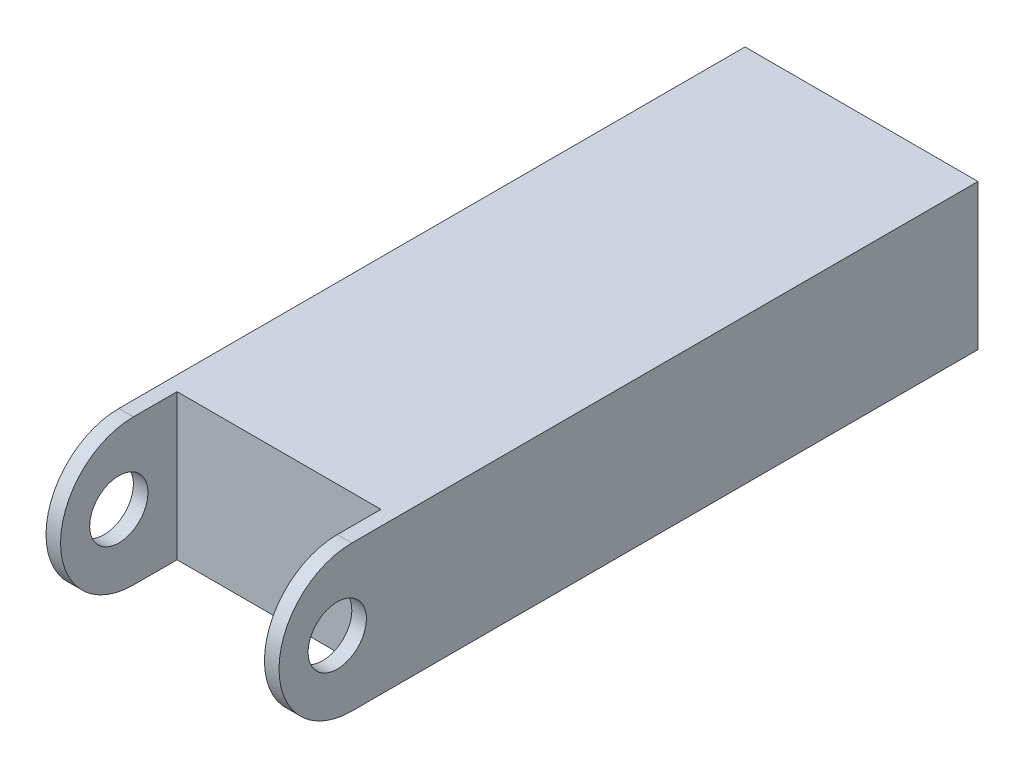
ISO-10303-21;
HEADER;
FILE_DESCRIPTION(('STEP AP214'),'2;1');
FILE_NAME('part.step','',(''),(''),'','','');
FILE_SCHEMA(('AUTOMOTIVE_DESIGN { 1 0 10303 214 1 1 1 1 }'));
ENDSEC;
DATA;
#1=APPLICATION_CONTEXT('core data for automotive mechanical design processes');
#2=APPLICATION_PROTOCOL_DEFINITION('international standard','automotive_design',2000,#1);
#3=PRODUCT_CONTEXT('',#1,'mechanical');
#4=PRODUCT('Part','Part','',(#3));
#5=PRODUCT_RELATED_PRODUCT_CATEGORY('part','',(#4));
#6=PRODUCT_DEFINITION_FORMATION('','',#4);
#7=PRODUCT_DEFINITION_CONTEXT('part definition',#1,'design');
#8=PRODUCT_DEFINITION('design','',#6,#7);
#9=PRODUCT_DEFINITION_SHAPE('','',#8);
#10=(LENGTH_UNIT() NAMED_UNIT(*) SI_UNIT(.MILLI.,.METRE.));
#11=(NAMED_UNIT(*) PLANE_ANGLE_UNIT() SI_UNIT($,.RADIAN.));
#12=(NAMED_UNIT(*) SI_UNIT($,.STERADIAN.) SOLID_ANGLE_UNIT());
#13=UNCERTAINTY_MEASURE_WITH_UNIT(LENGTH_MEASURE(1.E-05),#10,'distance_accuracy_value','');
#14=(GEOMETRIC_REPRESENTATION_CONTEXT(3) GLOBAL_UNCERTAINTY_ASSIGNED_CONTEXT((#13)) GLOBAL_UNIT_ASSIGNED_CONTEXT((#10,
#11,#12)) REPRESENTATION_CONTEXT('',''));
#15=CARTESIAN_POINT('',(0.,0.,0.));
#16=DIRECTION('',(0.,0.,1.));
#17=DIRECTION('',(1.,0.,0.));
#18=AXIS2_PLACEMENT_3D('',#15,#16,#17);
#19=CARTESIAN_POINT('',(-35.,0.,15.));
#20=DIRECTION('',(-1.,0.,0.));
#21=DIRECTION('',(0.,-1.,0.));
#22=AXIS2_PLACEMENT_3D('',#19,#20,#21);
#23=CYLINDRICAL_SURFACE('',#22,25.);
#24=DIRECTION('',(1.,0.,0.));
#25=VECTOR('',#24,1.);
#26=CARTESIAN_POINT('',(-35.,-25.,15.));
#27=LINE('',#26,#25);
#28=CARTESIAN_POINT('',(-35.,-25.,15.));
#29=VERTEX_POINT('',#28);
#30=CARTESIAN_POINT('',(-40.,-25.,15.));
#31=VERTEX_POINT('',#30);
#32=EDGE_CURVE('E158',#29,#31,#27,.F.);
#33=ORIENTED_EDGE('',*,*,#32,.F.);
#34=CARTESIAN_POINT('',(-35.,0.,15.));
#35=DIRECTION('',(1.,0.,0.));
#36=DIRECTION('',(0.,1.,0.));
#37=AXIS2_PLACEMENT_3D('',#34,#35,#36);
#38=CIRCLE('',#37,25.);
#39=CARTESIAN_POINT('',(-35.,25.,15.));
#40=VERTEX_POINT('',#39);
#41=EDGE_CURVE('E45',#40,#29,#38,.T.);
#42=ORIENTED_EDGE('',*,*,#41,.F.);
#43=DIRECTION('',(1.,0.,0.));
#44=VECTOR('',#43,1.);
#45=CARTESIAN_POINT('',(-35.,25.,15.));
#46=LINE('',#45,#44);
#47=CARTESIAN_POINT('',(-40.,25.,15.));
#48=VERTEX_POINT('',#47);
#49=EDGE_CURVE('E161',#48,#40,#46,.T.);
#50=ORIENTED_EDGE('',*,*,#49,.F.);
#51=CARTESIAN_POINT('',(-40.,0.,15.));
#52=DIRECTION('',(-1.,0.,0.));
#53=DIRECTION('',(0.,-1.,0.));
#54=AXIS2_PLACEMENT_3D('',#51,#52,#53);
#55=CIRCLE('',#54,25.);
#56=EDGE_CURVE('E11',#31,#48,#55,.T.);
#57=ORIENTED_EDGE('',*,*,#56,.F.);
#58=EDGE_LOOP('',(#33,#42,#50,#57));
#59=FACE_BOUND('',#58,.T.);
#60=ADVANCED_FACE('F37',(#59),#23,.T.);
#61=CARTESIAN_POINT('',(40.,0.,15.));
#62=DIRECTION('',(1.,0.,0.));
#63=DIRECTION('',(0.,1.,0.));
#64=AXIS2_PLACEMENT_3D('',#61,#62,#63);
#65=CYLINDRICAL_SURFACE('',#64,25.);
#66=DIRECTION('',(1.,0.,0.));
#67=VECTOR('',#66,1.);
#68=CARTESIAN_POINT('',(-40.,-25.,15.));
#69=LINE('',#68,#67);
#70=CARTESIAN_POINT('',(40.,-25.,15.));
#71=VERTEX_POINT('',#70);
#72=CARTESIAN_POINT('',(35.,-25.,15.));
#73=VERTEX_POINT('',#72);
#74=EDGE_CURVE('E119',#71,#73,#69,.F.);
#75=ORIENTED_EDGE('',*,*,#74,.F.);
#76=CARTESIAN_POINT('',(40.,0.,15.));
#77=DIRECTION('',(1.,0.,0.));
#78=DIRECTION('',(0.,1.,0.));
#79=AXIS2_PLACEMENT_3D('',#76,#77,#78);
#80=CIRCLE('',#79,25.);
#81=CARTESIAN_POINT('',(40.,25.,15.));
#82=VERTEX_POINT('',#81);
#83=EDGE_CURVE('E154',#82,#71,#80,.T.);
#84=ORIENTED_EDGE('',*,*,#83,.F.);
#85=DIRECTION('',(1.,0.,0.));
#86=VECTOR('',#85,1.);
#87=CARTESIAN_POINT('',(-40.,25.,15.));
#88=LINE('',#87,#86);
#89=CARTESIAN_POINT('',(35.,25.,15.));
#90=VERTEX_POINT('',#89);
#91=EDGE_CURVE('E151',#90,#82,#88,.T.);
#92=ORIENTED_EDGE('',*,*,#91,.F.);
#93=CARTESIAN_POINT('',(35.,0.,15.));
#94=DIRECTION('',(-1.,0.,0.));
#95=DIRECTION('',(0.,-1.,0.));
#96=AXIS2_PLACEMENT_3D('',#93,#94,#95);
#97=CIRCLE('',#96,25.);
#98=EDGE_CURVE('E156',#73,#90,#97,.T.);
#99=ORIENTED_EDGE('',*,*,#98,.F.);
#100=EDGE_LOOP('',(#75,#84,#92,#99));
#101=FACE_BOUND('',#100,.T.);
#102=ADVANCED_FACE('F201',(#101),#65,.T.);
#103=CARTESIAN_POINT('',(0.,0.,0.));
#104=DIRECTION('',(0.,0.,1.));
#105=DIRECTION('',(1.,0.,0.));
#106=AXIS2_PLACEMENT_3D('',#103,#104,#105);
#107=PLANE('',#106);
#108=DIRECTION('',(0.,1.,0.));
#109=VECTOR('',#108,1.);
#110=CARTESIAN_POINT('',(-35.,25.,0.));
#111=LINE('',#110,#109);
#112=CARTESIAN_POINT('',(-35.,-25.,0.));
#113=VERTEX_POINT('',#112);
#114=CARTESIAN_POINT('',(-35.,25.,0.));
#115=VERTEX_POINT('',#114);
#116=EDGE_CURVE('E107',#113,#115,#111,.T.);
#117=ORIENTED_EDGE('',*,*,#116,.F.);
#118=DIRECTION('',(1.,0.,0.));
#119=VECTOR('',#118,1.);
#120=CARTESIAN_POINT('',(-40.,-25.,0.));
#121=LINE('',#120,#119);
#122=CARTESIAN_POINT('',(35.,-25.,0.));
#123=VERTEX_POINT('',#122);
#124=EDGE_CURVE('E100',#113,#123,#121,.T.);
#125=ORIENTED_EDGE('',*,*,#124,.T.);
#126=DIRECTION('',(0.,1.,0.));
#127=VECTOR('',#126,1.);
#128=CARTESIAN_POINT('',(35.,25.,0.));
#129=LINE('',#128,#127);
#130=CARTESIAN_POINT('',(35.,25.,0.));
#131=VERTEX_POINT('',#130);
#132=EDGE_CURVE('E104',#123,#131,#129,.T.);
#133=ORIENTED_EDGE('',*,*,#132,.T.);
#134=DIRECTION('',(-1.,0.,0.));
#135=VECTOR('',#134,1.);
#136=CARTESIAN_POINT('',(-40.,25.,0.));
#137=LINE('',#136,#135);
#138=EDGE_CURVE('E111',#131,#115,#137,.T.);
#139=ORIENTED_EDGE('',*,*,#138,.T.);
#140=EDGE_LOOP('',(#117,#125,#133,#139));
#141=FACE_BOUND('',#140,.T.);
#142=ADVANCED_FACE('F102',(#141),#107,.T.);
#143=CARTESIAN_POINT('',(40.,25.,-200.));
#144=DIRECTION('',(1.,0.,0.));
#145=DIRECTION('',(0.,1.,0.));
#146=AXIS2_PLACEMENT_3D('',#143,#144,#145);
#147=PLANE('',#146);
#148=DIRECTION('',(0.,0.,1.));
#149=VECTOR('',#148,1.);
#150=CARTESIAN_POINT('',(40.,25.,-200.));
#151=LINE('',#150,#149);
#152=CARTESIAN_POINT('',(40.,25.,-200.));
#153=VERTEX_POINT('',#152);
#154=EDGE_CURVE('E139',#153,#82,#151,.T.);
#155=ORIENTED_EDGE('',*,*,#154,.T.);
#156=ORIENTED_EDGE('',*,*,#83,.T.);
#157=DIRECTION('',(0.,0.,1.));
#158=VECTOR('',#157,1.);
#159=CARTESIAN_POINT('',(40.,-25.,-200.));
#160=LINE('',#159,#158);
#161=CARTESIAN_POINT('',(40.,-25.,-200.));
#162=VERTEX_POINT('',#161);
#163=EDGE_CURVE('E141',#162,#71,#160,.T.);
#164=ORIENTED_EDGE('',*,*,#163,.F.);
#165=DIRECTION('',(0.,1.,0.));
#166=VECTOR('',#165,1.);
#167=CARTESIAN_POINT('',(40.,25.,-200.));
#168=LINE('',#167,#166);
#169=EDGE_CURVE('E110',#162,#153,#168,.T.);
#170=ORIENTED_EDGE('',*,*,#169,.T.);
#171=EDGE_LOOP('',(#155,#156,#164,#170));
#172=FACE_BOUND('',#171,.T.);
#173=CARTESIAN_POINT('',(40.,0.,20.));
#174=DIRECTION('',(1.,0.,0.));
#175=DIRECTION('',(0.,1.,0.));
#176=AXIS2_PLACEMENT_3D('',#173,#174,#175);
#177=CIRCLE('',#176,10.);
#178=CARTESIAN_POINT('',(40.,10.,20.));
#179=VERTEX_POINT('',#178);
#180=EDGE_CURVE('E169',#179,#179,#177,.T.);
#181=ORIENTED_EDGE('',*,*,#180,.F.);
#182=EDGE_LOOP('',(#181));
#183=FACE_BOUND('',#182,.T.);
#184=ADVANCED_FACE('F209',(#172,#183),#147,.T.);
#185=CARTESIAN_POINT('',(-40.,-25.,-200.));
#186=DIRECTION('',(0.,-1.,0.));
#187=DIRECTION('',(0.,0.,-1.));
#188=AXIS2_PLACEMENT_3D('',#185,#186,#187);
#189=PLANE('',#188);
#190=DIRECTION('',(0.,0.,-1.));
#191=VECTOR('',#190,1.);
#192=CARTESIAN_POINT('',(-35.,-25.,0.));
#193=LINE('',#192,#191);
#194=EDGE_CURVE('E166',#29,#113,#193,.T.);
#195=ORIENTED_EDGE('',*,*,#194,.F.);
#196=ORIENTED_EDGE('',*,*,#32,.T.);
#197=DIRECTION('',(0.,0.,1.));
#198=VECTOR('',#197,1.);
#199=CARTESIAN_POINT('',(-40.,-25.,-200.));
#200=LINE('',#199,#198);
#201=CARTESIAN_POINT('',(-40.,-25.,-200.));
#202=VERTEX_POINT('',#201);
#203=EDGE_CURVE('E143',#202,#31,#200,.T.);
#204=ORIENTED_EDGE('',*,*,#203,.F.);
#205=DIRECTION('',(1.,0.,0.));
#206=VECTOR('',#205,1.);
#207=CARTESIAN_POINT('',(-40.,-25.,-200.));
#208=LINE('',#207,#206);
#209=EDGE_CURVE('E137',#202,#162,#208,.T.);
#210=ORIENTED_EDGE('',*,*,#209,.T.);
#211=ORIENTED_EDGE('',*,*,#163,.T.);
#212=ORIENTED_EDGE('',*,*,#74,.T.);
#213=DIRECTION('',(0.,0.,-1.));
#214=VECTOR('',#213,1.);
#215=CARTESIAN_POINT('',(35.,-25.,0.));
#216=LINE('',#215,#214);
#217=EDGE_CURVE('E115',#73,#123,#216,.T.);
#218=ORIENTED_EDGE('',*,*,#217,.T.);
#219=ORIENTED_EDGE('',*,*,#124,.F.);
#220=EDGE_LOOP('',(#195,#196,#204,#210,#211,#212,#218,#219));
#221=FACE_BOUND('',#220,.T.);
#222=ADVANCED_FACE('F116',(#221),#189,.T.);
#223=CARTESIAN_POINT('',(-40.,25.,-200.));
#224=DIRECTION('',(-1.,0.,0.));
#225=DIRECTION('',(0.,-1.,0.));
#226=AXIS2_PLACEMENT_3D('',#223,#224,#225);
#227=PLANE('',#226);
#228=ORIENTED_EDGE('',*,*,#203,.T.);
#229=ORIENTED_EDGE('',*,*,#56,.T.);
#230=DIRECTION('',(0.,0.,1.));
#231=VECTOR('',#230,1.);
#232=CARTESIAN_POINT('',(-40.,25.,-200.));
#233=LINE('',#232,#231);
#234=CARTESIAN_POINT('',(-40.,25.,-200.));
#235=VERTEX_POINT('',#234);
#236=EDGE_CURVE('E145',#235,#48,#233,.T.);
#237=ORIENTED_EDGE('',*,*,#236,.F.);
#238=DIRECTION('',(0.,-1.,0.));
#239=VECTOR('',#238,1.);
#240=CARTESIAN_POINT('',(-40.,25.,-200.));
#241=LINE('',#240,#239);
#242=EDGE_CURVE('E134',#235,#202,#241,.T.);
#243=ORIENTED_EDGE('',*,*,#242,.T.);
#244=EDGE_LOOP('',(#228,#229,#237,#243));
#245=FACE_BOUND('',#244,.T.);
#246=CARTESIAN_POINT('',(-40.,0.,20.));
#247=DIRECTION('',(1.,0.,0.));
#248=DIRECTION('',(0.,1.,0.));
#249=AXIS2_PLACEMENT_3D('',#246,#247,#248);
#250=CIRCLE('',#249,10.);
#251=CARTESIAN_POINT('',(-40.,10.,20.));
#252=VERTEX_POINT('',#251);
#253=EDGE_CURVE('E183',#252,#252,#250,.T.);
#254=ORIENTED_EDGE('',*,*,#253,.T.);
#255=EDGE_LOOP('',(#254));
#256=FACE_BOUND('',#255,.T.);
#257=ADVANCED_FACE('F189',(#245,#256),#227,.T.);
#258=CARTESIAN_POINT('',(-40.,25.,-200.));
#259=DIRECTION('',(0.,1.,0.));
#260=DIRECTION('',(0.,0.,1.));
#261=AXIS2_PLACEMENT_3D('',#258,#259,#260);
#262=PLANE('',#261);
#263=ORIENTED_EDGE('',*,*,#236,.T.);
#264=ORIENTED_EDGE('',*,*,#49,.T.);
#265=DIRECTION('',(0.,0.,1.));
#266=VECTOR('',#265,1.);
#267=CARTESIAN_POINT('',(-35.,25.,40.));
#268=LINE('',#267,#266);
#269=EDGE_CURVE('E168',#115,#40,#268,.T.);
#270=ORIENTED_EDGE('',*,*,#269,.F.);
#271=ORIENTED_EDGE('',*,*,#138,.F.);
#272=DIRECTION('',(0.,0.,1.));
#273=VECTOR('',#272,1.);
#274=CARTESIAN_POINT('',(35.,25.,40.));
#275=LINE('',#274,#273);
#276=EDGE_CURVE('E121',#131,#90,#275,.T.);
#277=ORIENTED_EDGE('',*,*,#276,.T.);
#278=ORIENTED_EDGE('',*,*,#91,.T.);
#279=ORIENTED_EDGE('',*,*,#154,.F.);
#280=DIRECTION('',(-1.,0.,0.));
#281=VECTOR('',#280,1.);
#282=CARTESIAN_POINT('',(-40.,25.,-200.));
#283=LINE('',#282,#281);
#284=EDGE_CURVE('E131',#153,#235,#283,.T.);
#285=ORIENTED_EDGE('',*,*,#284,.T.);
#286=EDGE_LOOP('',(#263,#264,#270,#271,#277,#278,#279,#285));
#287=FACE_BOUND('',#286,.T.);
#288=ADVANCED_FACE('F179',(#287),#262,.T.);
#289=CARTESIAN_POINT('',(0.,0.,-200.));
#290=DIRECTION('',(0.,0.,1.));
#291=DIRECTION('',(1.,0.,0.));
#292=AXIS2_PLACEMENT_3D('',#289,#290,#291);
#293=PLANE('',#292);
#294=ORIENTED_EDGE('',*,*,#169,.F.);
#295=ORIENTED_EDGE('',*,*,#209,.F.);
#296=ORIENTED_EDGE('',*,*,#242,.F.);
#297=ORIENTED_EDGE('',*,*,#284,.F.);
#298=EDGE_LOOP('',(#294,#295,#296,#297));
#299=FACE_BOUND('',#298,.T.);
#300=ADVANCED_FACE('F220',(#299),#293,.F.);
#301=CARTESIAN_POINT('',(35.,0.,0.));
#302=DIRECTION('',(-1.,0.,0.));
#303=DIRECTION('',(0.,-1.,0.));
#304=AXIS2_PLACEMENT_3D('',#301,#302,#303);
#305=PLANE('',#304);
#306=CARTESIAN_POINT('',(35.,0.,20.));
#307=DIRECTION('',(1.,0.,0.));
#308=DIRECTION('',(0.,1.,0.));
#309=AXIS2_PLACEMENT_3D('',#306,#307,#308);
#310=CIRCLE('',#309,10.);
#311=CARTESIAN_POINT('',(35.,10.,20.));
#312=VERTEX_POINT('',#311);
#313=EDGE_CURVE('E172',#312,#312,#310,.T.);
#314=ORIENTED_EDGE('',*,*,#313,.T.);
#315=EDGE_LOOP('',(#314));
#316=FACE_BOUND('',#315,.T.);
#317=ORIENTED_EDGE('',*,*,#217,.F.);
#318=ORIENTED_EDGE('',*,*,#98,.T.);
#319=ORIENTED_EDGE('',*,*,#276,.F.);
#320=ORIENTED_EDGE('',*,*,#132,.F.);
#321=EDGE_LOOP('',(#317,#318,#319,#320));
#322=FACE_BOUND('',#321,.T.);
#323=ADVANCED_FACE('F123',(#316,#322),#305,.T.);
#324=CARTESIAN_POINT('',(35.,0.,20.));
#325=DIRECTION('',(1.,0.,0.));
#326=DIRECTION('',(0.,1.,0.));
#327=AXIS2_PLACEMENT_3D('',#324,#325,#326);
#328=CYLINDRICAL_SURFACE('',#327,10.);
#329=ORIENTED_EDGE('',*,*,#313,.F.);
#330=EDGE_LOOP('',(#329));
#331=FACE_BOUND('',#330,.T.);
#332=ORIENTED_EDGE('',*,*,#180,.T.);
#333=EDGE_LOOP('',(#332));
#334=FACE_BOUND('',#333,.T.);
#335=ADVANCED_FACE('F198',(#331,#334),#328,.F.);
#336=CARTESIAN_POINT('',(-35.,0.,0.));
#337=DIRECTION('',(1.,0.,0.));
#338=DIRECTION('',(0.,-1.,0.));
#339=AXIS2_PLACEMENT_3D('',#336,#337,#338);
#340=PLANE('',#339);
#341=ORIENTED_EDGE('',*,*,#269,.T.);
#342=ORIENTED_EDGE('',*,*,#41,.T.);
#343=ORIENTED_EDGE('',*,*,#194,.T.);
#344=ORIENTED_EDGE('',*,*,#116,.T.);
#345=EDGE_LOOP('',(#341,#342,#343,#344));
#346=FACE_BOUND('',#345,.T.);
#347=CARTESIAN_POINT('',(-35.,0.,20.));
#348=DIRECTION('',(1.,0.,0.));
#349=DIRECTION('',(0.,1.,0.));
#350=AXIS2_PLACEMENT_3D('',#347,#348,#349);
#351=CIRCLE('',#350,10.);
#352=CARTESIAN_POINT('',(-35.,10.,20.));
#353=VERTEX_POINT('',#352);
#354=EDGE_CURVE('E181',#353,#353,#351,.T.);
#355=ORIENTED_EDGE('',*,*,#354,.F.);
#356=EDGE_LOOP('',(#355));
#357=FACE_BOUND('',#356,.T.);
#358=ADVANCED_FACE('F164',(#346,#357),#340,.T.);
#359=CARTESIAN_POINT('',(-35.,0.,20.));
#360=DIRECTION('',(-1.,0.,0.));
#361=DIRECTION('',(0.,-1.,0.));
#362=AXIS2_PLACEMENT_3D('',#359,#360,#361);
#363=CYLINDRICAL_SURFACE('',#362,10.);
#364=ORIENTED_EDGE('',*,*,#354,.T.);
#365=EDGE_LOOP('',(#364));
#366=FACE_BOUND('',#365,.T.);
#367=ORIENTED_EDGE('',*,*,#253,.F.);
#368=EDGE_LOOP('',(#367));
#369=FACE_BOUND('',#368,.T.);
#370=ADVANCED_FACE('F191',(#366,#369),#363,.F.);
#371=CLOSED_SHELL('',(#60,#102,#142,#184,#222,#257,#288,#300,#323,#335,#358,#370));
#372=MANIFOLD_SOLID_BREP('B2',#371);
#373=ADVANCED_BREP_SHAPE_REPRESENTATION('',(#18,#372),#14);
#374=SHAPE_DEFINITION_REPRESENTATION(#9,#373);
ENDSEC;
END-ISO-10303-21;
